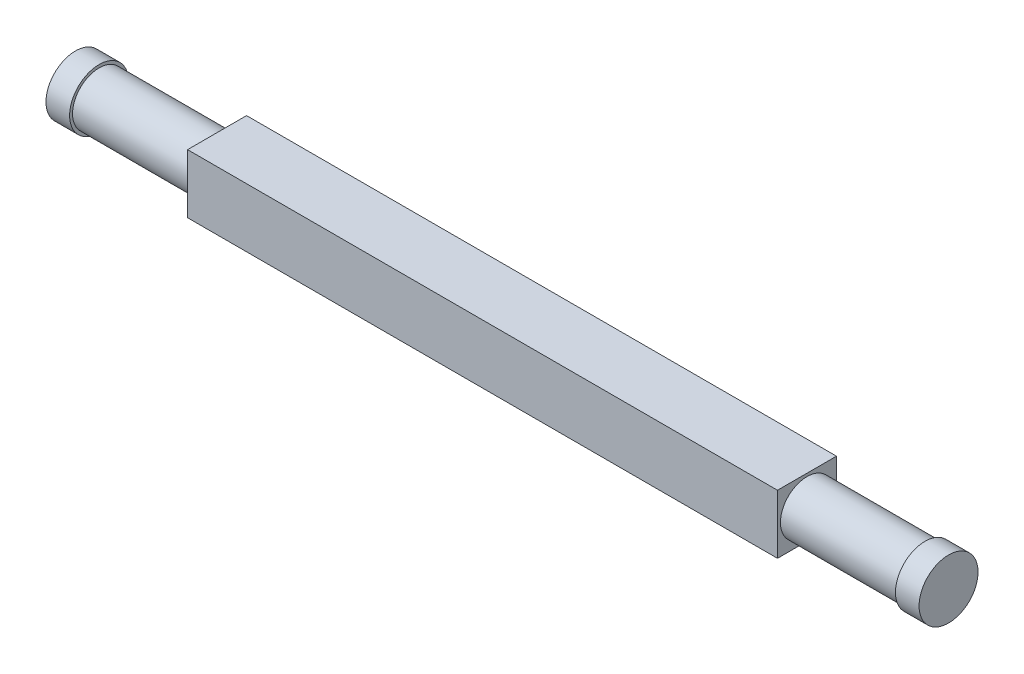
ISO-10303-21;
HEADER;
FILE_DESCRIPTION(('STEP AP214'),'2;1');
FILE_NAME('part.step','',(''),(''),'','','');
FILE_SCHEMA(('AUTOMOTIVE_DESIGN { 1 0 10303 214 1 1 1 1 }'));
ENDSEC;
DATA;
#1=APPLICATION_CONTEXT('core data for automotive mechanical design processes');
#2=APPLICATION_PROTOCOL_DEFINITION('international standard','automotive_design',2000,#1);
#3=PRODUCT_CONTEXT('',#1,'mechanical');
#4=PRODUCT('Part','Part','',(#3));
#5=PRODUCT_RELATED_PRODUCT_CATEGORY('part','',(#4));
#6=PRODUCT_DEFINITION_FORMATION('','',#4);
#7=PRODUCT_DEFINITION_CONTEXT('part definition',#1,'design');
#8=PRODUCT_DEFINITION('design','',#6,#7);
#9=PRODUCT_DEFINITION_SHAPE('','',#8);
#10=(LENGTH_UNIT() NAMED_UNIT(*) SI_UNIT(.MILLI.,.METRE.));
#11=(NAMED_UNIT(*) PLANE_ANGLE_UNIT() SI_UNIT($,.RADIAN.));
#12=(NAMED_UNIT(*) SI_UNIT($,.STERADIAN.) SOLID_ANGLE_UNIT());
#13=UNCERTAINTY_MEASURE_WITH_UNIT(LENGTH_MEASURE(1.E-05),#10,'distance_accuracy_value','');
#14=(GEOMETRIC_REPRESENTATION_CONTEXT(3) GLOBAL_UNCERTAINTY_ASSIGNED_CONTEXT((#13)) GLOBAL_UNIT_ASSIGNED_CONTEXT((#10,
#11,#12)) REPRESENTATION_CONTEXT('',''));
#15=CARTESIAN_POINT('',(0.,0.,0.));
#16=DIRECTION('',(0.,0.,1.));
#17=DIRECTION('',(1.,0.,0.));
#18=AXIS2_PLACEMENT_3D('',#15,#16,#17);
#19=CARTESIAN_POINT('',(0.,0.,5.));
#20=DIRECTION('',(-1.,0.,0.));
#21=DIRECTION('',(0.,0.,1.));
#22=AXIS2_PLACEMENT_3D('',#19,#20,#21);
#23=PLANE('',#22);
#24=CARTESIAN_POINT('',(0.,-2.5,2.5));
#25=DIRECTION('',(-1.,0.,0.));
#26=DIRECTION('',(0.,0.,1.));
#27=AXIS2_PLACEMENT_3D('',#24,#25,#26);
#28=CIRCLE('',#27,2.25);
#29=CARTESIAN_POINT('',(0.,-2.5,4.75));
#30=VERTEX_POINT('',#29);
#31=EDGE_CURVE('E132',#30,#30,#28,.T.);
#32=ORIENTED_EDGE('',*,*,#31,.T.);
#33=EDGE_LOOP('',(#32));
#34=FACE_BOUND('',#33,.T.);
#35=DIRECTION('',(0.,1.,0.));
#36=VECTOR('',#35,1.);
#37=CARTESIAN_POINT('',(0.,0.,0.));
#38=LINE('',#37,#36);
#39=CARTESIAN_POINT('',(0.,-5.,0.));
#40=VERTEX_POINT('',#39);
#41=CARTESIAN_POINT('',(0.,0.,0.));
#42=VERTEX_POINT('',#41);
#43=EDGE_CURVE('E100',#40,#42,#38,.T.);
#44=ORIENTED_EDGE('',*,*,#43,.T.);
#45=DIRECTION('',(0.,0.,-1.));
#46=VECTOR('',#45,1.);
#47=CARTESIAN_POINT('',(0.,0.,5.));
#48=LINE('',#47,#46);
#49=CARTESIAN_POINT('',(0.,0.,5.));
#50=VERTEX_POINT('',#49);
#51=EDGE_CURVE('E42',#50,#42,#48,.T.);
#52=ORIENTED_EDGE('',*,*,#51,.F.);
#53=DIRECTION('',(0.,1.,0.));
#54=VECTOR('',#53,1.);
#55=CARTESIAN_POINT('',(0.,0.,5.));
#56=LINE('',#55,#54);
#57=CARTESIAN_POINT('',(0.,-5.,5.));
#58=VERTEX_POINT('',#57);
#59=EDGE_CURVE('E86',#58,#50,#56,.T.);
#60=ORIENTED_EDGE('',*,*,#59,.F.);
#61=DIRECTION('',(0.,0.,-1.));
#62=VECTOR('',#61,1.);
#63=CARTESIAN_POINT('',(0.,-5.,5.));
#64=LINE('',#63,#62);
#65=EDGE_CURVE('E96',#58,#40,#64,.T.);
#66=ORIENTED_EDGE('',*,*,#65,.T.);
#67=EDGE_LOOP('',(#44,#52,#60,#66));
#68=FACE_BOUND('',#67,.T.);
#69=ADVANCED_FACE('F34',(#34,#68),#23,.F.);
#70=CARTESIAN_POINT('',(0.,0.,5.));
#71=DIRECTION('',(0.,-1.,0.));
#72=DIRECTION('',(1.,0.,0.));
#73=AXIS2_PLACEMENT_3D('',#70,#71,#72);
#74=PLANE('',#73);
#75=DIRECTION('',(-1.,0.,0.));
#76=VECTOR('',#75,1.);
#77=CARTESIAN_POINT('',(0.,0.,0.));
#78=LINE('',#77,#76);
#79=CARTESIAN_POINT('',(-50.,0.,0.));
#80=VERTEX_POINT('',#79);
#81=EDGE_CURVE('E91',#42,#80,#78,.T.);
#82=ORIENTED_EDGE('',*,*,#81,.T.);
#83=DIRECTION('',(0.,0.,-1.));
#84=VECTOR('',#83,1.);
#85=CARTESIAN_POINT('',(-50.,0.,5.));
#86=LINE('',#85,#84);
#87=CARTESIAN_POINT('',(-50.,0.,5.));
#88=VERTEX_POINT('',#87);
#89=EDGE_CURVE('E89',#88,#80,#86,.T.);
#90=ORIENTED_EDGE('',*,*,#89,.F.);
#91=DIRECTION('',(-1.,0.,0.));
#92=VECTOR('',#91,1.);
#93=CARTESIAN_POINT('',(0.,0.,5.));
#94=LINE('',#93,#92);
#95=EDGE_CURVE('E81',#50,#88,#94,.T.);
#96=ORIENTED_EDGE('',*,*,#95,.F.);
#97=ORIENTED_EDGE('',*,*,#51,.T.);
#98=EDGE_LOOP('',(#82,#90,#96,#97));
#99=FACE_BOUND('',#98,.T.);
#100=ADVANCED_FACE('F90',(#99),#74,.F.);
#101=CARTESIAN_POINT('',(-50.,0.,5.));
#102=DIRECTION('',(1.,0.,0.));
#103=DIRECTION('',(0.,0.,-1.));
#104=AXIS2_PLACEMENT_3D('',#101,#102,#103);
#105=PLANE('',#104);
#106=CARTESIAN_POINT('',(-50.,-2.5,2.5));
#107=DIRECTION('',(1.,0.,0.));
#108=DIRECTION('',(0.,0.,-1.));
#109=AXIS2_PLACEMENT_3D('',#106,#107,#108);
#110=CIRCLE('',#109,2.25);
#111=CARTESIAN_POINT('',(-50.,-2.5,0.250000000000001));
#112=VERTEX_POINT('',#111);
#113=EDGE_CURVE('E11',#112,#112,#110,.F.);
#114=ORIENTED_EDGE('',*,*,#113,.F.);
#115=EDGE_LOOP('',(#114));
#116=FACE_BOUND('',#115,.T.);
#117=DIRECTION('',(0.,-1.,0.));
#118=VECTOR('',#117,1.);
#119=CARTESIAN_POINT('',(-50.,0.,0.));
#120=LINE('',#119,#118);
#121=CARTESIAN_POINT('',(-50.,-5.00000000000001,0.));
#122=VERTEX_POINT('',#121);
#123=EDGE_CURVE('E67',#80,#122,#120,.T.);
#124=ORIENTED_EDGE('',*,*,#123,.T.);
#125=DIRECTION('',(0.,0.,-1.));
#126=VECTOR('',#125,1.);
#127=CARTESIAN_POINT('',(-50.,-5.00000000000001,5.));
#128=LINE('',#127,#126);
#129=CARTESIAN_POINT('',(-50.,-5.00000000000001,5.));
#130=VERTEX_POINT('',#129);
#131=EDGE_CURVE('E92',#130,#122,#128,.T.);
#132=ORIENTED_EDGE('',*,*,#131,.F.);
#133=DIRECTION('',(0.,-1.,0.));
#134=VECTOR('',#133,1.);
#135=CARTESIAN_POINT('',(-50.,0.,5.));
#136=LINE('',#135,#134);
#137=EDGE_CURVE('E84',#88,#130,#136,.T.);
#138=ORIENTED_EDGE('',*,*,#137,.F.);
#139=ORIENTED_EDGE('',*,*,#89,.T.);
#140=EDGE_LOOP('',(#124,#132,#138,#139));
#141=FACE_BOUND('',#140,.T.);
#142=ADVANCED_FACE('F94',(#116,#141),#105,.F.);
#143=CARTESIAN_POINT('',(0.,-5.,5.));
#144=DIRECTION('',(0.,1.,0.));
#145=DIRECTION('',(-1.,0.,0.));
#146=AXIS2_PLACEMENT_3D('',#143,#144,#145);
#147=PLANE('',#146);
#148=DIRECTION('',(1.,0.,0.));
#149=VECTOR('',#148,1.);
#150=CARTESIAN_POINT('',(0.,-5.,0.));
#151=LINE('',#150,#149);
#152=EDGE_CURVE('E73',#122,#40,#151,.T.);
#153=ORIENTED_EDGE('',*,*,#152,.T.);
#154=ORIENTED_EDGE('',*,*,#65,.F.);
#155=DIRECTION('',(1.,0.,0.));
#156=VECTOR('',#155,1.);
#157=CARTESIAN_POINT('',(0.,-5.,5.));
#158=LINE('',#157,#156);
#159=EDGE_CURVE('E50',#130,#58,#158,.T.);
#160=ORIENTED_EDGE('',*,*,#159,.F.);
#161=ORIENTED_EDGE('',*,*,#131,.T.);
#162=EDGE_LOOP('',(#153,#154,#160,#161));
#163=FACE_BOUND('',#162,.T.);
#164=ADVANCED_FACE('F122',(#163),#147,.F.);
#165=CARTESIAN_POINT('',(0.,0.,5.));
#166=DIRECTION('',(0.,0.,-1.));
#167=DIRECTION('',(-1.,0.,0.));
#168=AXIS2_PLACEMENT_3D('',#165,#166,#167);
#169=PLANE('',#168);
#170=ORIENTED_EDGE('',*,*,#59,.T.);
#171=ORIENTED_EDGE('',*,*,#95,.T.);
#172=ORIENTED_EDGE('',*,*,#137,.T.);
#173=ORIENTED_EDGE('',*,*,#159,.T.);
#174=EDGE_LOOP('',(#170,#171,#172,#173));
#175=FACE_BOUND('',#174,.T.);
#176=ADVANCED_FACE('F82',(#175),#169,.F.);
#177=CARTESIAN_POINT('',(0.,0.,0.));
#178=DIRECTION('',(0.,0.,-1.));
#179=DIRECTION('',(-1.,0.,0.));
#180=AXIS2_PLACEMENT_3D('',#177,#178,#179);
#181=PLANE('',#180);
#182=ORIENTED_EDGE('',*,*,#43,.F.);
#183=ORIENTED_EDGE('',*,*,#152,.F.);
#184=ORIENTED_EDGE('',*,*,#123,.F.);
#185=ORIENTED_EDGE('',*,*,#81,.F.);
#186=EDGE_LOOP('',(#182,#183,#184,#185));
#187=FACE_BOUND('',#186,.T.);
#188=ADVANCED_FACE('F111',(#187),#181,.T.);
#189=CARTESIAN_POINT('',(-60.,-2.5,2.5));
#190=DIRECTION('',(1.,0.,0.));
#191=DIRECTION('',(0.,0.,-1.));
#192=AXIS2_PLACEMENT_3D('',#189,#190,#191);
#193=CYLINDRICAL_SURFACE('',#192,2.25);
#194=CARTESIAN_POINT('',(-60.,-2.5,2.5));
#195=DIRECTION('',(-1.,0.,0.));
#196=DIRECTION('',(0.,0.,1.));
#197=AXIS2_PLACEMENT_3D('',#194,#195,#196);
#198=CIRCLE('',#197,2.25);
#199=CARTESIAN_POINT('',(-60.,-2.5,4.75));
#200=VERTEX_POINT('',#199);
#201=EDGE_CURVE('E103',#200,#200,#198,.T.);
#202=ORIENTED_EDGE('',*,*,#201,.F.);
#203=EDGE_LOOP('',(#202));
#204=FACE_BOUND('',#203,.T.);
#205=ORIENTED_EDGE('',*,*,#113,.T.);
#206=EDGE_LOOP('',(#205));
#207=FACE_BOUND('',#206,.T.);
#208=ADVANCED_FACE('F113',(#204,#207),#193,.T.);
#209=CARTESIAN_POINT('',(-62.,-2.5,2.5));
#210=DIRECTION('',(1.,0.,0.));
#211=DIRECTION('',(0.,0.,-1.));
#212=AXIS2_PLACEMENT_3D('',#209,#210,#211);
#213=CYLINDRICAL_SURFACE('',#212,2.5);
#214=CARTESIAN_POINT('',(-62.,-2.5,2.5));
#215=DIRECTION('',(-1.,0.,0.));
#216=DIRECTION('',(0.,0.,1.));
#217=AXIS2_PLACEMENT_3D('',#214,#215,#216);
#218=CIRCLE('',#217,2.5);
#219=CARTESIAN_POINT('',(-62.,-2.5,5.));
#220=VERTEX_POINT('',#219);
#221=EDGE_CURVE('E138',#220,#220,#218,.T.);
#222=ORIENTED_EDGE('',*,*,#221,.F.);
#223=EDGE_LOOP('',(#222));
#224=FACE_BOUND('',#223,.T.);
#225=CARTESIAN_POINT('',(-60.,-2.5,2.5));
#226=DIRECTION('',(-1.,0.,0.));
#227=DIRECTION('',(0.,0.,1.));
#228=AXIS2_PLACEMENT_3D('',#225,#226,#227);
#229=CIRCLE('',#228,2.5);
#230=CARTESIAN_POINT('',(-60.,-2.5,5.));
#231=VERTEX_POINT('',#230);
#232=EDGE_CURVE('E134',#231,#231,#229,.T.);
#233=ORIENTED_EDGE('',*,*,#232,.T.);
#234=EDGE_LOOP('',(#233));
#235=FACE_BOUND('',#234,.T.);
#236=ADVANCED_FACE('F119',(#224,#235),#213,.T.);
#237=CARTESIAN_POINT('',(-62.,-2.5,2.5));
#238=DIRECTION('',(-1.,0.,0.));
#239=DIRECTION('',(0.,0.,1.));
#240=AXIS2_PLACEMENT_3D('',#237,#238,#239);
#241=PLANE('',#240);
#242=ORIENTED_EDGE('',*,*,#221,.T.);
#243=EDGE_LOOP('',(#242));
#244=FACE_BOUND('',#243,.T.);
#245=ADVANCED_FACE('F193',(#244),#241,.T.);
#246=CARTESIAN_POINT('',(-60.,-2.5,2.5));
#247=DIRECTION('',(-1.,0.,0.));
#248=DIRECTION('',(0.,0.,1.));
#249=AXIS2_PLACEMENT_3D('',#246,#247,#248);
#250=PLANE('',#249);
#251=ORIENTED_EDGE('',*,*,#201,.T.);
#252=EDGE_LOOP('',(#251));
#253=FACE_BOUND('',#252,.T.);
#254=ORIENTED_EDGE('',*,*,#232,.F.);
#255=EDGE_LOOP('',(#254));
#256=FACE_BOUND('',#255,.T.);
#257=ADVANCED_FACE('F150',(#253,#256),#250,.F.);
#258=CARTESIAN_POINT('',(10.,-2.5,2.5));
#259=DIRECTION('',(-1.,0.,0.));
#260=DIRECTION('',(0.,0.,1.));
#261=AXIS2_PLACEMENT_3D('',#258,#259,#260);
#262=CYLINDRICAL_SURFACE('',#261,2.25);
#263=CARTESIAN_POINT('',(10.,-2.5,2.5));
#264=DIRECTION('',(1.,0.,0.));
#265=DIRECTION('',(0.,0.,-1.));
#266=AXIS2_PLACEMENT_3D('',#263,#264,#265);
#267=CIRCLE('',#266,2.25);
#268=CARTESIAN_POINT('',(10.,-2.5,0.250000000000001));
#269=VERTEX_POINT('',#268);
#270=EDGE_CURVE('E135',#269,#269,#267,.F.);
#271=ORIENTED_EDGE('',*,*,#270,.T.);
#272=EDGE_LOOP('',(#271));
#273=FACE_BOUND('',#272,.T.);
#274=ORIENTED_EDGE('',*,*,#31,.F.);
#275=EDGE_LOOP('',(#274));
#276=FACE_BOUND('',#275,.T.);
#277=ADVANCED_FACE('F211',(#273,#276),#262,.T.);
#278=CARTESIAN_POINT('',(12.,-2.5,2.5));
#279=DIRECTION('',(-1.,0.,0.));
#280=DIRECTION('',(0.,0.,1.));
#281=AXIS2_PLACEMENT_3D('',#278,#279,#280);
#282=CYLINDRICAL_SURFACE('',#281,2.5);
#283=CARTESIAN_POINT('',(12.,-2.5,2.5));
#284=DIRECTION('',(-1.,0.,0.));
#285=DIRECTION('',(0.,0.,1.));
#286=AXIS2_PLACEMENT_3D('',#283,#284,#285);
#287=CIRCLE('',#286,2.5);
#288=CARTESIAN_POINT('',(12.,-2.5,5.));
#289=VERTEX_POINT('',#288);
#290=EDGE_CURVE('E141',#289,#289,#287,.T.);
#291=ORIENTED_EDGE('',*,*,#290,.T.);
#292=EDGE_LOOP('',(#291));
#293=FACE_BOUND('',#292,.T.);
#294=CARTESIAN_POINT('',(10.,-2.5,2.5));
#295=DIRECTION('',(-1.,0.,0.));
#296=DIRECTION('',(0.,0.,1.));
#297=AXIS2_PLACEMENT_3D('',#294,#295,#296);
#298=CIRCLE('',#297,2.5);
#299=CARTESIAN_POINT('',(10.,-2.5,5.));
#300=VERTEX_POINT('',#299);
#301=EDGE_CURVE('E263',#300,#300,#298,.T.);
#302=ORIENTED_EDGE('',*,*,#301,.F.);
#303=EDGE_LOOP('',(#302));
#304=FACE_BOUND('',#303,.T.);
#305=ADVANCED_FACE('F225',(#293,#304),#282,.T.);
#306=CARTESIAN_POINT('',(12.,-2.5,2.5));
#307=DIRECTION('',(1.,0.,0.));
#308=DIRECTION('',(0.,0.,1.));
#309=AXIS2_PLACEMENT_3D('',#306,#307,#308);
#310=PLANE('',#309);
#311=ORIENTED_EDGE('',*,*,#290,.F.);
#312=EDGE_LOOP('',(#311));
#313=FACE_BOUND('',#312,.T.);
#314=ADVANCED_FACE('F235',(#313),#310,.T.);
#315=CARTESIAN_POINT('',(10.,-2.5,2.5));
#316=DIRECTION('',(1.,0.,0.));
#317=DIRECTION('',(0.,0.,1.));
#318=AXIS2_PLACEMENT_3D('',#315,#316,#317);
#319=PLANE('',#318);
#320=ORIENTED_EDGE('',*,*,#270,.F.);
#321=EDGE_LOOP('',(#320));
#322=FACE_BOUND('',#321,.T.);
#323=ORIENTED_EDGE('',*,*,#301,.T.);
#324=EDGE_LOOP('',(#323));
#325=FACE_BOUND('',#324,.T.);
#326=ADVANCED_FACE('F245',(#322,#325),#319,.F.);
#327=CLOSED_SHELL('',(#69,#100,#142,#164,#176,#188,#208,#236,#245,#257,#277,#305,#314,#326));
#328=MANIFOLD_SOLID_BREP('B2',#327);
#329=ADVANCED_BREP_SHAPE_REPRESENTATION('',(#18,#328),#14);
#330=SHAPE_DEFINITION_REPRESENTATION(#9,#329);
ENDSEC;
END-ISO-10303-21;
